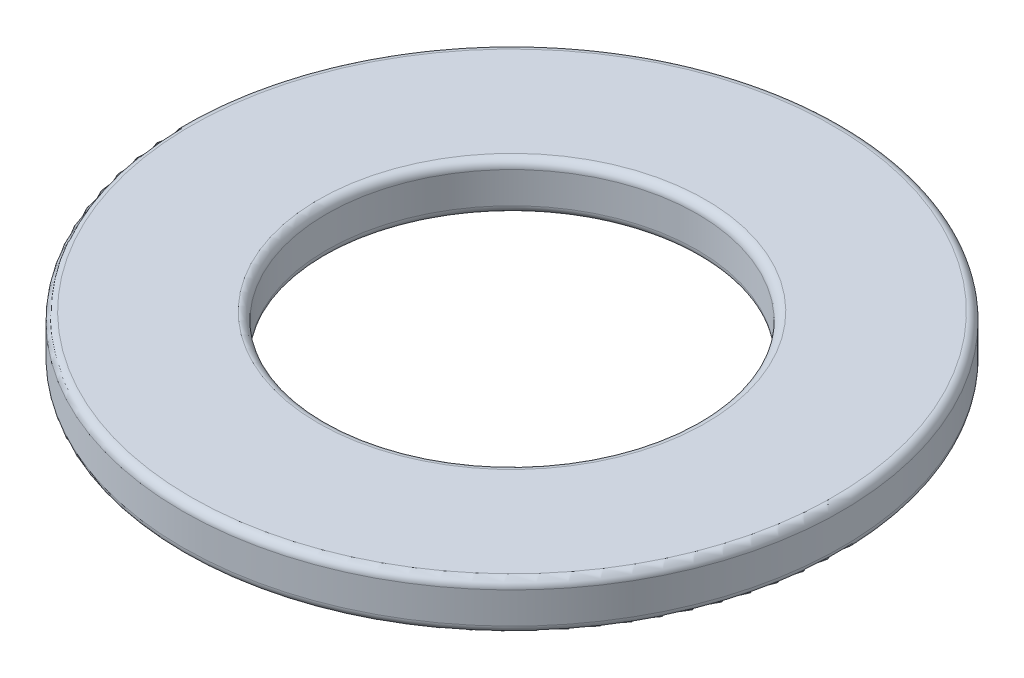
ISO-10303-21;
HEADER;
FILE_DESCRIPTION(('STEP AP214'),'2;1');
FILE_NAME('part.step','',(''),(''),'','','');
FILE_SCHEMA(('AUTOMOTIVE_DESIGN { 1 0 10303 214 1 1 1 1 }'));
ENDSEC;
DATA;
#1=APPLICATION_CONTEXT('core data for automotive mechanical design processes');
#2=APPLICATION_PROTOCOL_DEFINITION('international standard','automotive_design',2000,#1);
#3=PRODUCT_CONTEXT('',#1,'mechanical');
#4=PRODUCT('Part','Part','',(#3));
#5=PRODUCT_RELATED_PRODUCT_CATEGORY('part','',(#4));
#6=PRODUCT_DEFINITION_FORMATION('','',#4);
#7=PRODUCT_DEFINITION_CONTEXT('part definition',#1,'design');
#8=PRODUCT_DEFINITION('design','',#6,#7);
#9=PRODUCT_DEFINITION_SHAPE('','',#8);
#10=(LENGTH_UNIT() NAMED_UNIT(*) SI_UNIT(.MILLI.,.METRE.));
#11=(NAMED_UNIT(*) PLANE_ANGLE_UNIT() SI_UNIT($,.RADIAN.));
#12=(NAMED_UNIT(*) SI_UNIT($,.STERADIAN.) SOLID_ANGLE_UNIT());
#13=UNCERTAINTY_MEASURE_WITH_UNIT(LENGTH_MEASURE(1.E-05),#10,'distance_accuracy_value','');
#14=(GEOMETRIC_REPRESENTATION_CONTEXT(3) GLOBAL_UNCERTAINTY_ASSIGNED_CONTEXT((#13)) GLOBAL_UNIT_ASSIGNED_CONTEXT((#10,
#11,#12)) REPRESENTATION_CONTEXT('',''));
#15=CARTESIAN_POINT('',(0.,0.,0.));
#16=DIRECTION('',(0.,0.,1.));
#17=DIRECTION('',(1.,0.,0.));
#18=AXIS2_PLACEMENT_3D('',#15,#16,#17);
#19=CARTESIAN_POINT('',(0.,29.,0.));
#20=DIRECTION('',(0.,1.,0.));
#21=DIRECTION('',(0.,0.,1.));
#22=AXIS2_PLACEMENT_3D('',#19,#20,#21);
#23=PLANE('',#22);
#24=CARTESIAN_POINT('',(0.,29.,0.));
#25=DIRECTION('',(0.,1.,0.));
#26=DIRECTION('',(0.,0.,1.));
#27=AXIS2_PLACEMENT_3D('',#24,#25,#26);
#28=CIRCLE('',#27,117.5);
#29=CARTESIAN_POINT('',(0.,29.,117.5));
#30=VERTEX_POINT('',#29);
#31=EDGE_CURVE('E54',#30,#30,#28,.F.);
#32=ORIENTED_EDGE('',*,*,#31,.T.);
#33=EDGE_LOOP('',(#32));
#34=FACE_BOUND('',#33,.T.);
#35=CARTESIAN_POINT('',(0.,29.,0.));
#36=DIRECTION('',(0.,1.,0.));
#37=DIRECTION('',(0.,0.,1.));
#38=AXIS2_PLACEMENT_3D('',#35,#36,#37);
#39=CIRCLE('',#38,195.);
#40=CARTESIAN_POINT('',(0.,29.,195.));
#41=VERTEX_POINT('',#40);
#42=EDGE_CURVE('E57',#41,#41,#39,.T.);
#43=ORIENTED_EDGE('',*,*,#42,.T.);
#44=EDGE_LOOP('',(#43));
#45=FACE_BOUND('',#44,.T.);
#46=ADVANCED_FACE('F34',(#34,#45),#23,.T.);
#47=CARTESIAN_POINT('',(0.,0.,0.));
#48=DIRECTION('',(0.,1.,0.));
#49=DIRECTION('',(0.,0.,1.));
#50=AXIS2_PLACEMENT_3D('',#47,#48,#49);
#51=PLANE('',#50);
#52=CARTESIAN_POINT('',(0.,0.,0.));
#53=DIRECTION('',(0.,1.,0.));
#54=DIRECTION('',(0.,0.,1.));
#55=AXIS2_PLACEMENT_3D('',#52,#53,#54);
#56=CIRCLE('',#55,117.5);
#57=CARTESIAN_POINT('',(0.,0.,117.5));
#58=VERTEX_POINT('',#57);
#59=EDGE_CURVE('E45',#58,#58,#56,.T.);
#60=ORIENTED_EDGE('',*,*,#59,.T.);
#61=EDGE_LOOP('',(#60));
#62=FACE_BOUND('',#61,.T.);
#63=CARTESIAN_POINT('',(0.,0.,0.));
#64=DIRECTION('',(0.,1.,0.));
#65=DIRECTION('',(0.,0.,1.));
#66=AXIS2_PLACEMENT_3D('',#63,#64,#65);
#67=CIRCLE('',#66,195.);
#68=CARTESIAN_POINT('',(0.,0.,195.));
#69=VERTEX_POINT('',#68);
#70=EDGE_CURVE('E49',#69,#69,#67,.F.);
#71=ORIENTED_EDGE('',*,*,#70,.T.);
#72=EDGE_LOOP('',(#71));
#73=FACE_BOUND('',#72,.T.);
#74=ADVANCED_FACE('F77',(#62,#73),#51,.F.);
#75=CARTESIAN_POINT('',(0.,29.,0.));
#76=DIRECTION('',(0.,-1.,0.));
#77=DIRECTION('',(0.,0.,-1.));
#78=AXIS2_PLACEMENT_3D('',#75,#76,#77);
#79=CYLINDRICAL_SURFACE('',#78,200.);
#80=CARTESIAN_POINT('',(0.,5.,0.));
#81=DIRECTION('',(0.,1.,0.));
#82=DIRECTION('',(0.,0.,1.));
#83=AXIS2_PLACEMENT_3D('',#80,#81,#82);
#84=CIRCLE('',#83,200.);
#85=CARTESIAN_POINT('',(0.,5.,200.));
#86=VERTEX_POINT('',#85);
#87=EDGE_CURVE('E10',#86,#86,#84,.T.);
#88=ORIENTED_EDGE('',*,*,#87,.T.);
#89=EDGE_LOOP('',(#88));
#90=FACE_BOUND('',#89,.T.);
#91=CARTESIAN_POINT('',(0.,24.,0.));
#92=DIRECTION('',(0.,1.,0.));
#93=DIRECTION('',(0.,0.,1.));
#94=AXIS2_PLACEMENT_3D('',#91,#92,#93);
#95=CIRCLE('',#94,200.);
#96=CARTESIAN_POINT('',(0.,24.,200.));
#97=VERTEX_POINT('',#96);
#98=EDGE_CURVE('E41',#97,#97,#95,.F.);
#99=ORIENTED_EDGE('',*,*,#98,.T.);
#100=EDGE_LOOP('',(#99));
#101=FACE_BOUND('',#100,.T.);
#102=ADVANCED_FACE('F80',(#90,#101),#79,.T.);
#103=CARTESIAN_POINT('',(0.,29.,0.));
#104=DIRECTION('',(0.,-1.,0.));
#105=DIRECTION('',(0.,0.,-1.));
#106=AXIS2_PLACEMENT_3D('',#103,#104,#105);
#107=CYLINDRICAL_SURFACE('',#106,112.5);
#108=CARTESIAN_POINT('',(0.,24.,0.));
#109=DIRECTION('',(0.,1.,0.));
#110=DIRECTION('',(0.,0.,1.));
#111=AXIS2_PLACEMENT_3D('',#108,#109,#110);
#112=CIRCLE('',#111,112.5);
#113=CARTESIAN_POINT('',(0.,24.,112.5));
#114=VERTEX_POINT('',#113);
#115=EDGE_CURVE('E60',#114,#114,#112,.T.);
#116=ORIENTED_EDGE('',*,*,#115,.T.);
#117=EDGE_LOOP('',(#116));
#118=FACE_BOUND('',#117,.T.);
#119=CARTESIAN_POINT('',(0.,5.,0.));
#120=DIRECTION('',(0.,1.,0.));
#121=DIRECTION('',(0.,0.,1.));
#122=AXIS2_PLACEMENT_3D('',#119,#120,#121);
#123=CIRCLE('',#122,112.5);
#124=CARTESIAN_POINT('',(0.,5.,112.5));
#125=VERTEX_POINT('',#124);
#126=EDGE_CURVE('E63',#125,#125,#123,.F.);
#127=ORIENTED_EDGE('',*,*,#126,.T.);
#128=EDGE_LOOP('',(#127));
#129=FACE_BOUND('',#128,.T.);
#130=ADVANCED_FACE('F67',(#118,#129),#107,.F.);
#131=CARTESIAN_POINT('',(0.,24.,0.));
#132=DIRECTION('',(0.,1.,0.));
#133=DIRECTION('',(0.,0.,1.));
#134=AXIS2_PLACEMENT_3D('',#131,#132,#133);
#135=TOROIDAL_SURFACE('',#134,117.5,5.);
#136=ORIENTED_EDGE('',*,*,#31,.F.);
#137=EDGE_LOOP('',(#136));
#138=FACE_BOUND('',#137,.T.);
#139=ORIENTED_EDGE('',*,*,#115,.F.);
#140=EDGE_LOOP('',(#139));
#141=FACE_BOUND('',#140,.T.);
#142=ADVANCED_FACE('F73',(#138,#141),#135,.T.);
#143=CARTESIAN_POINT('',(0.,5.,0.));
#144=DIRECTION('',(0.,1.,0.));
#145=DIRECTION('',(0.,0.,1.));
#146=AXIS2_PLACEMENT_3D('',#143,#144,#145);
#147=TOROIDAL_SURFACE('',#146,117.5,5.);
#148=ORIENTED_EDGE('',*,*,#126,.F.);
#149=EDGE_LOOP('',(#148));
#150=FACE_BOUND('',#149,.T.);
#151=ORIENTED_EDGE('',*,*,#59,.F.);
#152=EDGE_LOOP('',(#151));
#153=FACE_BOUND('',#152,.T.);
#154=ADVANCED_FACE('F69',(#150,#153),#147,.T.);
#155=CARTESIAN_POINT('',(0.,5.,0.));
#156=DIRECTION('',(0.,1.,0.));
#157=DIRECTION('',(0.,0.,1.));
#158=AXIS2_PLACEMENT_3D('',#155,#156,#157);
#159=TOROIDAL_SURFACE('',#158,195.,5.);
#160=ORIENTED_EDGE('',*,*,#70,.F.);
#161=EDGE_LOOP('',(#160));
#162=FACE_BOUND('',#161,.T.);
#163=ORIENTED_EDGE('',*,*,#87,.F.);
#164=EDGE_LOOP('',(#163));
#165=FACE_BOUND('',#164,.T.);
#166=ADVANCED_FACE('F72',(#162,#165),#159,.T.);
#167=CARTESIAN_POINT('',(0.,24.,0.));
#168=DIRECTION('',(0.,1.,0.));
#169=DIRECTION('',(0.,0.,1.));
#170=AXIS2_PLACEMENT_3D('',#167,#168,#169);
#171=TOROIDAL_SURFACE('',#170,195.,5.);
#172=ORIENTED_EDGE('',*,*,#98,.F.);
#173=EDGE_LOOP('',(#172));
#174=FACE_BOUND('',#173,.T.);
#175=ORIENTED_EDGE('',*,*,#42,.F.);
#176=EDGE_LOOP('',(#175));
#177=FACE_BOUND('',#176,.T.);
#178=ADVANCED_FACE('F36',(#174,#177),#171,.T.);
#179=CLOSED_SHELL('',(#46,#74,#102,#130,#142,#154,#166,#178));
#180=MANIFOLD_SOLID_BREP('B2',#179);
#181=ADVANCED_BREP_SHAPE_REPRESENTATION('',(#18,#180),#14);
#182=SHAPE_DEFINITION_REPRESENTATION(#9,#181);
ENDSEC;
END-ISO-10303-21;
